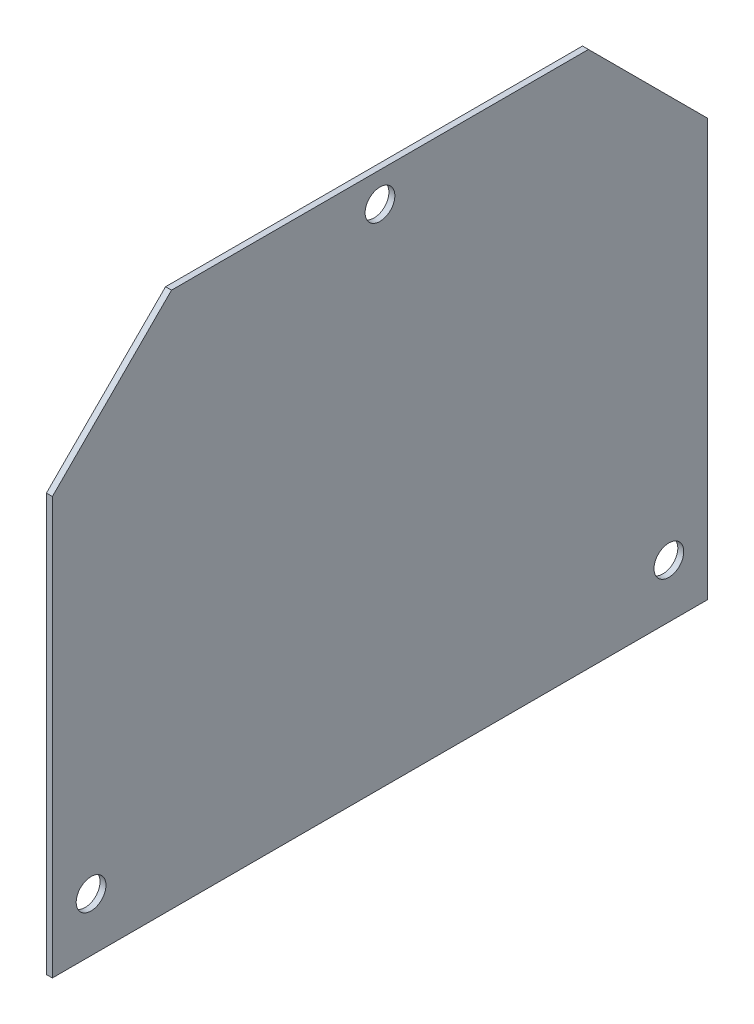
ISO-10303-21;
HEADER;
FILE_DESCRIPTION(('STEP AP214'),'2;1');
FILE_NAME('part.step','',(''),(''),'','','');
FILE_SCHEMA(('AUTOMOTIVE_DESIGN { 1 0 10303 214 1 1 1 1 }'));
ENDSEC;
DATA;
#1=APPLICATION_CONTEXT('core data for automotive mechanical design processes');
#2=APPLICATION_PROTOCOL_DEFINITION('international standard','automotive_design',2000,#1);
#3=PRODUCT_CONTEXT('',#1,'mechanical');
#4=PRODUCT('Part','Part','',(#3));
#5=PRODUCT_RELATED_PRODUCT_CATEGORY('part','',(#4));
#6=PRODUCT_DEFINITION_FORMATION('','',#4);
#7=PRODUCT_DEFINITION_CONTEXT('part definition',#1,'design');
#8=PRODUCT_DEFINITION('design','',#6,#7);
#9=PRODUCT_DEFINITION_SHAPE('','',#8);
#10=(LENGTH_UNIT() NAMED_UNIT(*) SI_UNIT(.MILLI.,.METRE.));
#11=(NAMED_UNIT(*) PLANE_ANGLE_UNIT() SI_UNIT($,.RADIAN.));
#12=(NAMED_UNIT(*) SI_UNIT($,.STERADIAN.) SOLID_ANGLE_UNIT());
#13=UNCERTAINTY_MEASURE_WITH_UNIT(LENGTH_MEASURE(1.E-05),#10,'distance_accuracy_value','');
#14=(GEOMETRIC_REPRESENTATION_CONTEXT(3) GLOBAL_UNCERTAINTY_ASSIGNED_CONTEXT((#13)) GLOBAL_UNIT_ASSIGNED_CONTEXT((#10,
#11,#12)) REPRESENTATION_CONTEXT('',''));
#15=CARTESIAN_POINT('',(0.,0.,0.));
#16=DIRECTION('',(0.,0.,1.));
#17=DIRECTION('',(1.,0.,0.));
#18=AXIS2_PLACEMENT_3D('',#15,#16,#17);
#19=CARTESIAN_POINT('',(1.,0.,0.));
#20=DIRECTION('',(1.,0.,0.));
#21=DIRECTION('',(0.,1.,0.));
#22=AXIS2_PLACEMENT_3D('',#19,#20,#21);
#23=PLANE('',#22);
#24=CARTESIAN_POINT('',(1.,40.,0.));
#25=DIRECTION('',(-1.,0.,0.));
#26=DIRECTION('',(0.,0.,-1.));
#27=AXIS2_PLACEMENT_3D('',#24,#25,#26);
#28=CIRCLE('',#27,2.5);
#29=CARTESIAN_POINT('',(1.,40.,2.5));
#30=VERTEX_POINT('',#29);
#31=EDGE_CURVE('E140',#30,#30,#28,.T.);
#32=ORIENTED_EDGE('',*,*,#31,.T.);
#33=EDGE_LOOP('',(#32));
#34=FACE_BOUND('',#33,.T.);
#35=CARTESIAN_POINT('',(1.,-36.,48.5));
#36=DIRECTION('',(-1.,0.,0.));
#37=DIRECTION('',(0.,0.,-1.));
#38=AXIS2_PLACEMENT_3D('',#35,#36,#37);
#39=CIRCLE('',#38,2.5);
#40=CARTESIAN_POINT('',(1.,-36.,51.));
#41=VERTEX_POINT('',#40);
#42=EDGE_CURVE('E169',#41,#41,#39,.T.);
#43=ORIENTED_EDGE('',*,*,#42,.T.);
#44=EDGE_LOOP('',(#43));
#45=FACE_BOUND('',#44,.T.);
#46=CARTESIAN_POINT('',(1.,-36.,-48.5));
#47=DIRECTION('',(-1.,0.,0.));
#48=DIRECTION('',(0.,0.,-1.));
#49=AXIS2_PLACEMENT_3D('',#46,#47,#48);
#50=CIRCLE('',#49,2.5);
#51=CARTESIAN_POINT('',(1.,-36.,-46.));
#52=VERTEX_POINT('',#51);
#53=EDGE_CURVE('E149',#52,#52,#50,.T.);
#54=ORIENTED_EDGE('',*,*,#53,.T.);
#55=EDGE_LOOP('',(#54));
#56=FACE_BOUND('',#55,.T.);
#57=DIRECTION('',(0.,-0.707106781186548,-0.707106781186548));
#58=VECTOR('',#57,1.);
#59=CARTESIAN_POINT('',(1.,37.5,-42.5));
#60=LINE('',#59,#58);
#61=CARTESIAN_POINT('',(1.,45.,-35.));
#62=VERTEX_POINT('',#61);
#63=CARTESIAN_POINT('',(1.,25.,-55.));
#64=VERTEX_POINT('',#63);
#65=EDGE_CURVE('E159',#62,#64,#60,.T.);
#66=ORIENTED_EDGE('',*,*,#65,.F.);
#67=DIRECTION('',(0.,0.,1.));
#68=VECTOR('',#67,1.);
#69=CARTESIAN_POINT('',(1.,45.,-55.));
#70=LINE('',#69,#68);
#71=CARTESIAN_POINT('',(1.,45.,35.));
#72=VERTEX_POINT('',#71);
#73=EDGE_CURVE('E125',#62,#72,#70,.T.);
#74=ORIENTED_EDGE('',*,*,#73,.T.);
#75=DIRECTION('',(0.,0.707106781186548,-0.707106781186548));
#76=VECTOR('',#75,1.);
#77=CARTESIAN_POINT('',(1.,37.5,42.5));
#78=LINE('',#77,#76);
#79=CARTESIAN_POINT('',(1.,25.,55.));
#80=VERTEX_POINT('',#79);
#81=EDGE_CURVE('E188',#80,#72,#78,.T.);
#82=ORIENTED_EDGE('',*,*,#81,.F.);
#83=DIRECTION('',(0.,-1.,0.));
#84=VECTOR('',#83,1.);
#85=CARTESIAN_POINT('',(1.,45.,55.));
#86=LINE('',#85,#84);
#87=CARTESIAN_POINT('',(1.,-45.,55.));
#88=VERTEX_POINT('',#87);
#89=EDGE_CURVE('E9',#80,#88,#86,.T.);
#90=ORIENTED_EDGE('',*,*,#89,.T.);
#91=DIRECTION('',(0.,0.,-1.));
#92=VECTOR('',#91,1.);
#93=CARTESIAN_POINT('',(1.,-45.,55.));
#94=LINE('',#93,#92);
#95=CARTESIAN_POINT('',(1.,-45.,-55.));
#96=VERTEX_POINT('',#95);
#97=EDGE_CURVE('E17',#88,#96,#94,.T.);
#98=ORIENTED_EDGE('',*,*,#97,.T.);
#99=DIRECTION('',(0.,1.,0.));
#100=VECTOR('',#99,1.);
#101=CARTESIAN_POINT('',(1.,-45.,-55.));
#102=LINE('',#101,#100);
#103=EDGE_CURVE('E60',#96,#64,#102,.T.);
#104=ORIENTED_EDGE('',*,*,#103,.T.);
#105=EDGE_LOOP('',(#66,#74,#82,#90,#98,#104));
#106=FACE_BOUND('',#105,.T.);
#107=ADVANCED_FACE('F14',(#34,#45,#56,#106),#23,.T.);
#108=CARTESIAN_POINT('',(0.,45.,55.));
#109=DIRECTION('',(0.,0.,1.));
#110=DIRECTION('',(1.,0.,0.));
#111=AXIS2_PLACEMENT_3D('',#108,#109,#110);
#112=PLANE('',#111);
#113=DIRECTION('',(1.,0.,0.));
#114=VECTOR('',#113,1.);
#115=CARTESIAN_POINT('',(0.,25.,55.));
#116=LINE('',#115,#114);
#117=CARTESIAN_POINT('',(0.,25.,55.));
#118=VERTEX_POINT('',#117);
#119=EDGE_CURVE('E174',#118,#80,#116,.T.);
#120=ORIENTED_EDGE('',*,*,#119,.F.);
#121=DIRECTION('',(0.,-1.,0.));
#122=VECTOR('',#121,1.);
#123=CARTESIAN_POINT('',(0.,45.,55.));
#124=LINE('',#123,#122);
#125=CARTESIAN_POINT('',(0.,-45.,55.));
#126=VERTEX_POINT('',#125);
#127=EDGE_CURVE('E118',#118,#126,#124,.T.);
#128=ORIENTED_EDGE('',*,*,#127,.T.);
#129=DIRECTION('',(1.,0.,0.));
#130=VECTOR('',#129,1.);
#131=CARTESIAN_POINT('',(0.,-45.,55.));
#132=LINE('',#131,#130);
#133=EDGE_CURVE('E24',#126,#88,#132,.T.);
#134=ORIENTED_EDGE('',*,*,#133,.T.);
#135=ORIENTED_EDGE('',*,*,#89,.F.);
#136=EDGE_LOOP('',(#120,#128,#134,#135));
#137=FACE_BOUND('',#136,.T.);
#138=ADVANCED_FACE('F287',(#137),#112,.T.);
#139=CARTESIAN_POINT('',(0.,-45.,55.));
#140=DIRECTION('',(0.,-1.,0.));
#141=DIRECTION('',(0.,0.,-1.));
#142=AXIS2_PLACEMENT_3D('',#139,#140,#141);
#143=PLANE('',#142);
#144=DIRECTION('',(0.,0.,-1.));
#145=VECTOR('',#144,1.);
#146=CARTESIAN_POINT('',(0.,-45.,55.));
#147=LINE('',#146,#145);
#148=CARTESIAN_POINT('',(0.,-45.,-55.));
#149=VERTEX_POINT('',#148);
#150=EDGE_CURVE('E112',#126,#149,#147,.T.);
#151=ORIENTED_EDGE('',*,*,#150,.T.);
#152=DIRECTION('',(1.,0.,0.));
#153=VECTOR('',#152,1.);
#154=CARTESIAN_POINT('',(0.,-45.,-55.));
#155=LINE('',#154,#153);
#156=EDGE_CURVE('E104',#149,#96,#155,.T.);
#157=ORIENTED_EDGE('',*,*,#156,.T.);
#158=ORIENTED_EDGE('',*,*,#97,.F.);
#159=ORIENTED_EDGE('',*,*,#133,.F.);
#160=EDGE_LOOP('',(#151,#157,#158,#159));
#161=FACE_BOUND('',#160,.T.);
#162=ADVANCED_FACE('F113',(#161),#143,.T.);
#163=CARTESIAN_POINT('',(0.,-45.,-55.));
#164=DIRECTION('',(0.,0.,-1.));
#165=DIRECTION('',(0.,-1.,0.));
#166=AXIS2_PLACEMENT_3D('',#163,#164,#165);
#167=PLANE('',#166);
#168=DIRECTION('',(-1.,0.,0.));
#169=VECTOR('',#168,1.);
#170=CARTESIAN_POINT('',(0.,25.,-55.));
#171=LINE('',#170,#169);
#172=CARTESIAN_POINT('',(0.,25.,-55.));
#173=VERTEX_POINT('',#172);
#174=EDGE_CURVE('E156',#64,#173,#171,.T.);
#175=ORIENTED_EDGE('',*,*,#174,.F.);
#176=ORIENTED_EDGE('',*,*,#103,.F.);
#177=ORIENTED_EDGE('',*,*,#156,.F.);
#178=DIRECTION('',(0.,1.,0.));
#179=VECTOR('',#178,1.);
#180=CARTESIAN_POINT('',(0.,-45.,-55.));
#181=LINE('',#180,#179);
#182=EDGE_CURVE('E72',#149,#173,#181,.T.);
#183=ORIENTED_EDGE('',*,*,#182,.T.);
#184=EDGE_LOOP('',(#175,#176,#177,#183));
#185=FACE_BOUND('',#184,.T.);
#186=ADVANCED_FACE('F106',(#185),#167,.T.);
#187=CARTESIAN_POINT('',(0.,35.,45.));
#188=DIRECTION('',(0.,0.707106781186548,0.707106781186548));
#189=DIRECTION('',(1.,0.,0.));
#190=AXIS2_PLACEMENT_3D('',#187,#188,#189);
#191=PLANE('',#190);
#192=ORIENTED_EDGE('',*,*,#81,.T.);
#193=DIRECTION('',(-1.,0.,0.));
#194=VECTOR('',#193,1.);
#195=CARTESIAN_POINT('',(0.,45.,35.));
#196=LINE('',#195,#194);
#197=CARTESIAN_POINT('',(0.,45.,35.));
#198=VERTEX_POINT('',#197);
#199=EDGE_CURVE('E132',#72,#198,#196,.T.);
#200=ORIENTED_EDGE('',*,*,#199,.T.);
#201=DIRECTION('',(0.,-0.707106781186548,0.707106781186548));
#202=VECTOR('',#201,1.);
#203=CARTESIAN_POINT('',(0.,37.5,42.5));
#204=LINE('',#203,#202);
#205=EDGE_CURVE('E143',#198,#118,#204,.T.);
#206=ORIENTED_EDGE('',*,*,#205,.T.);
#207=ORIENTED_EDGE('',*,*,#119,.T.);
#208=EDGE_LOOP('',(#192,#200,#206,#207));
#209=FACE_BOUND('',#208,.T.);
#210=ADVANCED_FACE('F306',(#209),#191,.T.);
#211=CARTESIAN_POINT('',(0.,0.,0.));
#212=DIRECTION('',(1.,0.,0.));
#213=DIRECTION('',(0.,1.,0.));
#214=AXIS2_PLACEMENT_3D('',#211,#212,#213);
#215=PLANE('',#214);
#216=CARTESIAN_POINT('',(0.,40.,0.));
#217=DIRECTION('',(1.,0.,0.));
#218=DIRECTION('',(0.,0.,-1.));
#219=AXIS2_PLACEMENT_3D('',#216,#217,#218);
#220=CIRCLE('',#219,2.5);
#221=CARTESIAN_POINT('',(0.,40.,2.5));
#222=VERTEX_POINT('',#221);
#223=EDGE_CURVE('E139',#222,#222,#220,.T.);
#224=ORIENTED_EDGE('',*,*,#223,.T.);
#225=EDGE_LOOP('',(#224));
#226=FACE_BOUND('',#225,.T.);
#227=CARTESIAN_POINT('',(0.,-36.,48.5));
#228=DIRECTION('',(1.,0.,0.));
#229=DIRECTION('',(0.,0.,-1.));
#230=AXIS2_PLACEMENT_3D('',#227,#228,#229);
#231=CIRCLE('',#230,2.5);
#232=CARTESIAN_POINT('',(0.,-36.,51.));
#233=VERTEX_POINT('',#232);
#234=EDGE_CURVE('E168',#233,#233,#231,.T.);
#235=ORIENTED_EDGE('',*,*,#234,.T.);
#236=EDGE_LOOP('',(#235));
#237=FACE_BOUND('',#236,.T.);
#238=CARTESIAN_POINT('',(0.,-36.,-48.5));
#239=DIRECTION('',(1.,0.,0.));
#240=DIRECTION('',(0.,0.,-1.));
#241=AXIS2_PLACEMENT_3D('',#238,#239,#240);
#242=CIRCLE('',#241,2.5);
#243=CARTESIAN_POINT('',(0.,-36.,-46.));
#244=VERTEX_POINT('',#243);
#245=EDGE_CURVE('E163',#244,#244,#242,.T.);
#246=ORIENTED_EDGE('',*,*,#245,.T.);
#247=EDGE_LOOP('',(#246));
#248=FACE_BOUND('',#247,.T.);
#249=DIRECTION('',(0.,0.707106781186548,0.707106781186548));
#250=VECTOR('',#249,1.);
#251=CARTESIAN_POINT('',(0.,37.5,-42.5));
#252=LINE('',#251,#250);
#253=CARTESIAN_POINT('',(0.,45.,-35.));
#254=VERTEX_POINT('',#253);
#255=EDGE_CURVE('E122',#173,#254,#252,.T.);
#256=ORIENTED_EDGE('',*,*,#255,.F.);
#257=ORIENTED_EDGE('',*,*,#182,.F.);
#258=ORIENTED_EDGE('',*,*,#150,.F.);
#259=ORIENTED_EDGE('',*,*,#127,.F.);
#260=ORIENTED_EDGE('',*,*,#205,.F.);
#261=DIRECTION('',(0.,0.,1.));
#262=VECTOR('',#261,1.);
#263=CARTESIAN_POINT('',(0.,45.,-55.));
#264=LINE('',#263,#262);
#265=EDGE_CURVE('E147',#254,#198,#264,.T.);
#266=ORIENTED_EDGE('',*,*,#265,.F.);
#267=EDGE_LOOP('',(#256,#257,#258,#259,#260,#266));
#268=FACE_BOUND('',#267,.T.);
#269=ADVANCED_FACE('F120',(#226,#237,#248,#268),#215,.F.);
#270=CARTESIAN_POINT('',(0.,45.,-55.));
#271=DIRECTION('',(0.,1.,0.));
#272=DIRECTION('',(1.,0.,0.));
#273=AXIS2_PLACEMENT_3D('',#270,#271,#272);
#274=PLANE('',#273);
#275=DIRECTION('',(1.,0.,0.));
#276=VECTOR('',#275,1.);
#277=CARTESIAN_POINT('',(0.,45.,-35.));
#278=LINE('',#277,#276);
#279=EDGE_CURVE('E144',#254,#62,#278,.T.);
#280=ORIENTED_EDGE('',*,*,#279,.F.);
#281=ORIENTED_EDGE('',*,*,#265,.T.);
#282=ORIENTED_EDGE('',*,*,#199,.F.);
#283=ORIENTED_EDGE('',*,*,#73,.F.);
#284=EDGE_LOOP('',(#280,#281,#282,#283));
#285=FACE_BOUND('',#284,.T.);
#286=ADVANCED_FACE('F210',(#285),#274,.T.);
#287=CARTESIAN_POINT('',(0.,35.,-45.));
#288=DIRECTION('',(0.,0.707106781186548,-0.707106781186548));
#289=DIRECTION('',(-1.,0.,0.));
#290=AXIS2_PLACEMENT_3D('',#287,#288,#289);
#291=PLANE('',#290);
#292=ORIENTED_EDGE('',*,*,#65,.T.);
#293=ORIENTED_EDGE('',*,*,#174,.T.);
#294=ORIENTED_EDGE('',*,*,#255,.T.);
#295=ORIENTED_EDGE('',*,*,#279,.T.);
#296=EDGE_LOOP('',(#292,#293,#294,#295));
#297=FACE_BOUND('',#296,.T.);
#298=ADVANCED_FACE('F205',(#297),#291,.T.);
#299=CARTESIAN_POINT('',(-141.130221979704,40.,0.));
#300=DIRECTION('',(1.,0.,0.));
#301=DIRECTION('',(0.,0.,-1.));
#302=AXIS2_PLACEMENT_3D('',#299,#300,#301);
#303=CYLINDRICAL_SURFACE('',#302,2.5);
#304=ORIENTED_EDGE('',*,*,#31,.F.);
#305=DIRECTION('',(-1.,0.,0.));
#306=VECTOR('',#305,1.);
#307=CARTESIAN_POINT('',(-141.130221979704,40.,2.5));
#308=LINE('',#307,#306);
#309=EDGE_CURVE('E135',#30,#222,#308,.T.);
#310=ORIENTED_EDGE('',*,*,#309,.T.);
#311=ORIENTED_EDGE('',*,*,#223,.F.);
#312=ORIENTED_EDGE('',*,*,#309,.F.);
#313=EDGE_LOOP('',(#304,#310,#311,#312));
#314=FACE_BOUND('',#313,.T.);
#315=ADVANCED_FACE('F314',(#314),#303,.F.);
#316=CARTESIAN_POINT('',(-141.130221979704,-36.,48.5));
#317=DIRECTION('',(1.,0.,0.));
#318=DIRECTION('',(0.,0.,-1.));
#319=AXIS2_PLACEMENT_3D('',#316,#317,#318);
#320=CYLINDRICAL_SURFACE('',#319,2.5);
#321=ORIENTED_EDGE('',*,*,#42,.F.);
#322=DIRECTION('',(-1.,0.,0.));
#323=VECTOR('',#322,1.);
#324=CARTESIAN_POINT('',(-141.130221979704,-36.,51.));
#325=LINE('',#324,#323);
#326=EDGE_CURVE('E164',#41,#233,#325,.T.);
#327=ORIENTED_EDGE('',*,*,#326,.T.);
#328=ORIENTED_EDGE('',*,*,#234,.F.);
#329=ORIENTED_EDGE('',*,*,#326,.F.);
#330=EDGE_LOOP('',(#321,#327,#328,#329));
#331=FACE_BOUND('',#330,.T.);
#332=ADVANCED_FACE('F318',(#331),#320,.F.);
#333=CARTESIAN_POINT('',(-141.130221979704,-36.,-48.5));
#334=DIRECTION('',(1.,0.,0.));
#335=DIRECTION('',(0.,0.,-1.));
#336=AXIS2_PLACEMENT_3D('',#333,#334,#335);
#337=CYLINDRICAL_SURFACE('',#336,2.5);
#338=ORIENTED_EDGE('',*,*,#53,.F.);
#339=DIRECTION('',(-1.,0.,0.));
#340=VECTOR('',#339,1.);
#341=CARTESIAN_POINT('',(-141.130221979704,-36.,-46.));
#342=LINE('',#341,#340);
#343=EDGE_CURVE('E153',#52,#244,#342,.T.);
#344=ORIENTED_EDGE('',*,*,#343,.T.);
#345=ORIENTED_EDGE('',*,*,#245,.F.);
#346=ORIENTED_EDGE('',*,*,#343,.F.);
#347=EDGE_LOOP('',(#338,#344,#345,#346));
#348=FACE_BOUND('',#347,.T.);
#349=ADVANCED_FACE('F335',(#348),#337,.F.);
#350=CLOSED_SHELL('',(#107,#138,#162,#186,#210,#269,#286,#298,#315,#332,#349));
#351=MANIFOLD_SOLID_BREP('B1',#350);
#352=ADVANCED_BREP_SHAPE_REPRESENTATION('',(#18,#351),#14);
#353=SHAPE_DEFINITION_REPRESENTATION(#9,#352);
ENDSEC;
END-ISO-10303-21;
